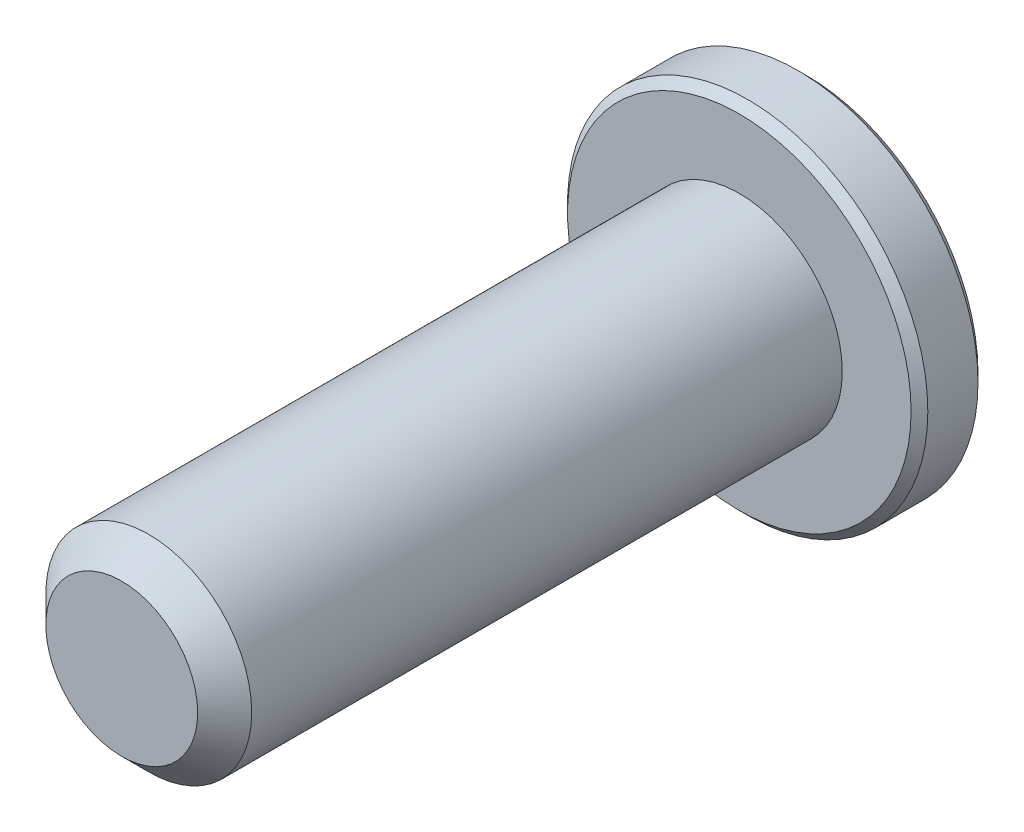
ISO-10303-21;
HEADER;
FILE_DESCRIPTION(('STEP AP214'),'2;1');
FILE_NAME('part.step','',(''),(''),'','','');
FILE_SCHEMA(('AUTOMOTIVE_DESIGN { 1 0 10303 214 1 1 1 1 }'));
ENDSEC;
DATA;
#1=APPLICATION_CONTEXT('core data for automotive mechanical design processes');
#2=APPLICATION_PROTOCOL_DEFINITION('international standard','automotive_design',2000,#1);
#3=PRODUCT_CONTEXT('',#1,'mechanical');
#4=PRODUCT('Part','Part','',(#3));
#5=PRODUCT_RELATED_PRODUCT_CATEGORY('part','',(#4));
#6=PRODUCT_DEFINITION_FORMATION('','',#4);
#7=PRODUCT_DEFINITION_CONTEXT('part definition',#1,'design');
#8=PRODUCT_DEFINITION('design','',#6,#7);
#9=PRODUCT_DEFINITION_SHAPE('','',#8);
#10=(LENGTH_UNIT() NAMED_UNIT(*) SI_UNIT(.MILLI.,.METRE.));
#11=(NAMED_UNIT(*) PLANE_ANGLE_UNIT() SI_UNIT($,.RADIAN.));
#12=(NAMED_UNIT(*) SI_UNIT($,.STERADIAN.) SOLID_ANGLE_UNIT());
#13=UNCERTAINTY_MEASURE_WITH_UNIT(LENGTH_MEASURE(1.E-05),#10,'distance_accuracy_value','');
#14=(GEOMETRIC_REPRESENTATION_CONTEXT(3) GLOBAL_UNCERTAINTY_ASSIGNED_CONTEXT((#13)) GLOBAL_UNIT_ASSIGNED_CONTEXT((#10,
#11,#12)) REPRESENTATION_CONTEXT('',''));
#15=CARTESIAN_POINT('',(0.,0.,0.));
#16=DIRECTION('',(0.,0.,1.));
#17=DIRECTION('',(1.,0.,0.));
#18=AXIS2_PLACEMENT_3D('',#15,#16,#17);
#19=CARTESIAN_POINT('',(0.,0.,-6.65));
#20=DIRECTION('',(0.,0.,1.));
#21=DIRECTION('',(1.,0.,0.));
#22=AXIS2_PLACEMENT_3D('',#19,#20,#21);
#23=PLANE('',#22);
#24=CARTESIAN_POINT('',(0.,0.,-6.65));
#25=DIRECTION('',(0.,0.,1.));
#26=DIRECTION('',(1.,0.,0.));
#27=AXIS2_PLACEMENT_3D('',#24,#25,#26);
#28=CIRCLE('',#27,3.3375);
#29=CARTESIAN_POINT('',(3.3375,0.,-6.65));
#30=VERTEX_POINT('',#29);
#31=EDGE_CURVE('E159',#30,#30,#28,.F.);
#32=ORIENTED_EDGE('',*,*,#31,.T.);
#33=EDGE_LOOP('',(#32));
#34=FACE_BOUND('',#33,.T.);
#35=CARTESIAN_POINT('',(0.,0.,-6.65));
#36=DIRECTION('',(0.,0.,1.));
#37=DIRECTION('',(1.,0.,0.));
#38=AXIS2_PLACEMENT_3D('',#35,#36,#37);
#39=CIRCLE('',#38,1.44337567297406);
#40=CARTESIAN_POINT('',(1.25,0.721687836487034,-6.65));
#41=VERTEX_POINT('',#40);
#42=CARTESIAN_POINT('',(0.,1.44337567297406,-6.65));
#43=VERTEX_POINT('',#42);
#44=EDGE_CURVE('E98',#41,#43,#39,.T.);
#45=ORIENTED_EDGE('',*,*,#44,.T.);
#46=CARTESIAN_POINT('',(0.,0.,-6.65));
#47=DIRECTION('',(0.,0.,1.));
#48=DIRECTION('',(1.,0.,0.));
#49=AXIS2_PLACEMENT_3D('',#46,#47,#48);
#50=CIRCLE('',#49,1.44337567297406);
#51=CARTESIAN_POINT('',(-1.25,0.721687836487028,-6.65));
#52=VERTEX_POINT('',#51);
#53=EDGE_CURVE('E110',#43,#52,#50,.T.);
#54=ORIENTED_EDGE('',*,*,#53,.T.);
#55=CARTESIAN_POINT('',(0.,0.,-6.65));
#56=DIRECTION('',(0.,0.,1.));
#57=DIRECTION('',(1.,0.,0.));
#58=AXIS2_PLACEMENT_3D('',#55,#56,#57);
#59=CIRCLE('',#58,1.44337567297406);
#60=CARTESIAN_POINT('',(-1.25,-0.72168783648703,-6.65));
#61=VERTEX_POINT('',#60);
#62=EDGE_CURVE('E131',#52,#61,#59,.T.);
#63=ORIENTED_EDGE('',*,*,#62,.T.);
#64=CARTESIAN_POINT('',(0.,0.,-6.65));
#65=DIRECTION('',(0.,0.,1.));
#66=DIRECTION('',(1.,0.,0.));
#67=AXIS2_PLACEMENT_3D('',#64,#65,#66);
#68=CIRCLE('',#67,1.44337567297406);
#69=CARTESIAN_POINT('',(0.,-1.44337567297406,-6.65));
#70=VERTEX_POINT('',#69);
#71=EDGE_CURVE('E416',#61,#70,#68,.T.);
#72=ORIENTED_EDGE('',*,*,#71,.T.);
#73=CARTESIAN_POINT('',(0.,0.,-6.65));
#74=DIRECTION('',(0.,0.,1.));
#75=DIRECTION('',(1.,0.,0.));
#76=AXIS2_PLACEMENT_3D('',#73,#74,#75);
#77=CIRCLE('',#76,1.44337567297406);
#78=CARTESIAN_POINT('',(1.25,-0.721687836487033,-6.65));
#79=VERTEX_POINT('',#78);
#80=EDGE_CURVE('E417',#70,#79,#77,.T.);
#81=ORIENTED_EDGE('',*,*,#80,.T.);
#82=CARTESIAN_POINT('',(0.,0.,-6.65));
#83=DIRECTION('',(0.,0.,1.));
#84=DIRECTION('',(1.,0.,0.));
#85=AXIS2_PLACEMENT_3D('',#82,#83,#84);
#86=CIRCLE('',#85,1.44337567297406);
#87=EDGE_CURVE('E113',#79,#41,#86,.T.);
#88=ORIENTED_EDGE('',*,*,#87,.T.);
#89=EDGE_LOOP('',(#45,#54,#63,#72,#81,#88));
#90=FACE_BOUND('',#89,.T.);
#91=ADVANCED_FACE('F39',(#34,#90),#23,.F.);
#92=CARTESIAN_POINT('',(1.25,0.721687836487033,-5.675));
#93=DIRECTION('',(-0.499999999999999,-0.866025403784439,0.));
#94=DIRECTION('',(0.866025403784439,-0.499999999999999,0.));
#95=AXIS2_PLACEMENT_3D('',#92,#93,#94);
#96=PLANE('',#95);
#97=DIRECTION('',(0.,0.,-1.));
#98=VECTOR('',#97,1.);
#99=CARTESIAN_POINT('',(0.,1.44337567297406,-5.675));
#100=LINE('',#99,#98);
#101=CARTESIAN_POINT('',(0.,1.44337567297406,-5.675));
#102=VERTEX_POINT('',#101);
#103=EDGE_CURVE('E127',#102,#43,#100,.T.);
#104=ORIENTED_EDGE('',*,*,#103,.T.);
#105=CARTESIAN_POINT('',(1.2502,0.721572366433196,-6.65011548390914));
#106=CARTESIAN_POINT('',(1.20722483292841,0.746384090710445,-6.6253216680551));
#107=CARTESIAN_POINT('',(1.16353099525405,0.771610739653665,-6.60198373441868));
#108=CARTESIAN_POINT('',(1.07443406915806,0.823050873919155,-6.55925200408454));
#109=CARTESIAN_POINT('',(1.02902250164293,0.849269254648334,-6.53988199236042));
#110=CARTESIAN_POINT('',(0.937452179064738,0.902137405038636,-6.50670048341348));
#111=CARTESIAN_POINT('',(0.891316759824112,0.928773701756387,-6.49280555905266));
#112=CARTESIAN_POINT('',(0.798029919592406,0.982632884076012,-6.47139728216064));
#113=CARTESIAN_POINT('',(0.750881350863619,1.00985412292348,-6.46386794156679));
#114=CARTESIAN_POINT('',(0.669626443112746,1.05676666578643,-6.45707449805071));
#115=CARTESIAN_POINT('',(0.635625123372058,1.07639733689152,-6.45606855910435));
#116=CARTESIAN_POINT('',(0.567682235567521,1.11562418145499,-6.45776141491132));
#117=CARTESIAN_POINT('',(0.533740682344341,1.1352203463451,-6.46046102721554));
#118=CARTESIAN_POINT('',(0.4661851435425,1.1742235548576,-6.46940893031638));
#119=CARTESIAN_POINT('',(0.432571492713224,1.19363040521232,-6.47566052589971));
#120=CARTESIAN_POINT('',(0.365905361782186,1.23212011385119,-6.49137568141391));
#121=CARTESIAN_POINT('',(0.332853128969704,1.2512028293628,-6.50084062008746));
#122=CARTESIAN_POINT('',(0.248200308399735,1.30007715810653,-6.52893139068759));
#123=CARTESIAN_POINT('',(0.197133507570361,1.32956058931202,-6.5496701574522));
#124=CARTESIAN_POINT('',(0.0969991458867448,1.38737318998519,-6.59638713467148));
#125=CARTESIAN_POINT('',(0.0479256884217303,1.41570576386268,-6.62234829594677));
#126=CARTESIAN_POINT('',(-0.000199999999999984,1.4434911430279,-6.65011548390914));
#127=B_SPLINE_CURVE_WITH_KNOTS('',3,(#105,#106,#107,#108,#109,#110,#111,#112,#113,#114,#115,
#116,#117,#118,#119,#120,#121,#122,#123,#124,#125,#126),.UNSPECIFIED.,.F.,.F.,(4,2,2,2,2,2,2,2,
2,2,4),(0.,0.166533409618303,0.33403760728976,0.498880396489696,0.663307919240271,
0.780963963458823,0.898645970148449,1.01643764860773,1.13427993171549,1.3214865203214,
1.50809158792573),.UNSPECIFIED.);
#128=EDGE_CURVE('E95',#41,#43,#127,.T.);
#129=ORIENTED_EDGE('',*,*,#128,.F.);
#130=DIRECTION('',(0.,0.,-1.));
#131=VECTOR('',#130,1.);
#132=CARTESIAN_POINT('',(1.25,0.721687836487033,-5.675));
#133=LINE('',#132,#131);
#134=CARTESIAN_POINT('',(1.25,0.721687836487033,-5.675));
#135=VERTEX_POINT('',#134);
#136=EDGE_CURVE('E394',#135,#41,#133,.T.);
#137=ORIENTED_EDGE('',*,*,#136,.F.);
#138=DIRECTION('',(-0.866025403784439,0.499999999999999,0.));
#139=VECTOR('',#138,1.);
#140=CARTESIAN_POINT('',(1.25,0.721687836487033,-5.675));
#141=LINE('',#140,#139);
#142=EDGE_CURVE('E122',#135,#102,#141,.T.);
#143=ORIENTED_EDGE('',*,*,#142,.T.);
#144=EDGE_LOOP('',(#104,#129,#137,#143));
#145=FACE_BOUND('',#144,.T.);
#146=ADVANCED_FACE('F134',(#145),#96,.T.);
#147=CARTESIAN_POINT('',(1.25,-0.721687836487029,-5.675));
#148=DIRECTION('',(-1.,0.,0.));
#149=DIRECTION('',(0.,-1.,0.));
#150=AXIS2_PLACEMENT_3D('',#147,#148,#149);
#151=PLANE('',#150);
#152=ORIENTED_EDGE('',*,*,#136,.T.);
#153=CARTESIAN_POINT('',(1.25,-1.38992943348888,-7.07595678276481));
#154=CARTESIAN_POINT('',(1.25,-1.35585360144598,-7.05062384590546));
#155=CARTESIAN_POINT('',(1.25,-1.32158265708561,-7.0255540386235));
#156=CARTESIAN_POINT('',(1.25,-1.25257320054391,-6.97604777210552));
#157=CARTESIAN_POINT('',(1.25,-1.21783456799034,-6.95161148084676));
#158=CARTESIAN_POINT('',(1.25,-1.11229379200971,-6.87906617261387));
#159=CARTESIAN_POINT('',(1.25,-1.04068485708168,-6.83211103925946));
#160=CARTESIAN_POINT('',(1.25,-0.890834011639571,-6.74037081666435));
#161=CARTESIAN_POINT('',(1.25,-0.812441254075324,-6.69582917123014));
#162=CARTESIAN_POINT('',(1.25,-0.651805951733885,-6.61466295887272));
#163=CARTESIAN_POINT('',(1.25,-0.56957751460335,-6.57801179406796));
#164=CARTESIAN_POINT('',(1.25,-0.445666902783946,-6.53318878472561));
#165=CARTESIAN_POINT('',(1.25,-0.405715906756982,-6.52024564314349));
#166=CARTESIAN_POINT('',(1.25,-0.324892689132276,-6.4975737854096));
#167=CARTESIAN_POINT('',(1.25,-0.284020400151317,-6.48784530519787));
#168=CARTESIAN_POINT('',(1.25,-0.202258662465061,-6.47225763981377));
#169=CARTESIAN_POINT('',(1.25,-0.161381483064384,-6.46633507343161));
#170=CARTESIAN_POINT('',(1.25,-0.0792441307238302,-6.45846702132594));
#171=CARTESIAN_POINT('',(1.25,-0.0379840154943749,-6.45652094579608));
#172=CARTESIAN_POINT('',(1.25,0.043234160036465,-6.45673289649202));
#173=CARTESIAN_POINT('',(1.25,0.0831926097530767,-6.45876454904398));
#174=CARTESIAN_POINT('',(1.25,0.16274644611995,-6.46655218105582));
#175=CARTESIAN_POINT('',(1.25,0.202341758544679,-6.47230890544306));
#176=CARTESIAN_POINT('',(1.25,0.28154631912982,-6.48733861417404));
#177=CARTESIAN_POINT('',(1.25,0.321144394728611,-6.49666962749469));
#178=CARTESIAN_POINT('',(1.25,0.399480919290786,-6.51836703523828));
#179=CARTESIAN_POINT('',(1.25,0.438219456017128,-6.53073311819671));
#180=CARTESIAN_POINT('',(1.25,0.562551887219005,-6.57501108328111));
#181=CARTESIAN_POINT('',(1.25,0.646311872820087,-6.61206181080176));
#182=CARTESIAN_POINT('',(1.25,0.809873231963305,-6.69436414583907));
#183=CARTESIAN_POINT('',(1.25,0.88965874213862,-6.73964571023902));
#184=CARTESIAN_POINT('',(1.25,1.04210036236046,-6.83298293010409));
#185=CARTESIAN_POINT('',(1.25,1.11491334005909,-6.88078550196313));
#186=CARTESIAN_POINT('',(1.25,1.22219009712169,-6.95464867004972));
#187=CARTESIAN_POINT('',(1.25,1.25748474843868,-6.97952350030935));
#188=CARTESIAN_POINT('',(1.25,1.32759376690005,-7.02992188471591));
#189=CARTESIAN_POINT('',(1.25,1.36240826213734,-7.05544526047357));
#190=CARTESIAN_POINT('',(1.25,1.3970231565127,-7.08123727369858));
#191=B_SPLINE_CURVE_WITH_KNOTS('',3,(#153,#154,#155,#156,#157,#158,#159,#160,#161,#162,#163,
#164,#165,#166,#167,#168,#169,#170,#171,#172,#173,#174,#175,#176,#177,#178,#179,#180,#181,#182,
#183,#184,#185,#186,#187,#188,#189,#190),.UNSPECIFIED.,.F.,.F.,(4,2,2,2,2,2,2,2,2,2,2,2,2,2,2,2,
2,2,4),(0.,0.127379033817002,0.254791503830238,0.51156114040546,0.781814668857771,
1.05114242314894,1.17702064742503,1.30290810848098,1.42664072359053,1.55035498493451,
1.67020252454504,1.7900740382739,1.91198034452075,2.03387414574236,2.30782771694623,
2.58279909340041,2.84397769429347,2.97351138093345,3.10300981562539),.UNSPECIFIED.);
#192=EDGE_CURVE('E103',#79,#41,#191,.T.);
#193=ORIENTED_EDGE('',*,*,#192,.F.);
#194=DIRECTION('',(0.,0.,-1.));
#195=VECTOR('',#194,1.);
#196=CARTESIAN_POINT('',(1.25,-0.721687836487029,-5.675));
#197=LINE('',#196,#195);
#198=CARTESIAN_POINT('',(1.25,-0.721687836487029,-5.675));
#199=VERTEX_POINT('',#198);
#200=EDGE_CURVE('E397',#199,#79,#197,.T.);
#201=ORIENTED_EDGE('',*,*,#200,.F.);
#202=DIRECTION('',(0.,1.,0.));
#203=VECTOR('',#202,1.);
#204=CARTESIAN_POINT('',(1.25,-0.721687836487029,-5.675));
#205=LINE('',#204,#203);
#206=EDGE_CURVE('E55',#199,#135,#205,.T.);
#207=ORIENTED_EDGE('',*,*,#206,.T.);
#208=EDGE_LOOP('',(#152,#193,#201,#207));
#209=FACE_BOUND('',#208,.T.);
#210=ADVANCED_FACE('F183',(#209),#151,.T.);
#211=CARTESIAN_POINT('',(0.,-1.44337567297406,-5.675));
#212=DIRECTION('',(-0.5,0.866025403784438,0.));
#213=DIRECTION('',(-0.866025403784439,-0.5,0.));
#214=AXIS2_PLACEMENT_3D('',#211,#212,#213);
#215=PLANE('',#214);
#216=ORIENTED_EDGE('',*,*,#200,.T.);
#217=CARTESIAN_POINT('',(-0.000199999999999349,-1.4434911430279,-6.65011548390913));
#218=CARTESIAN_POINT('',(0.0427751670715871,-1.41867941875065,-6.6253216680551));
#219=CARTESIAN_POINT('',(0.0864690047459484,-1.39345276980743,-6.60198373441868));
#220=CARTESIAN_POINT('',(0.175565930841942,-1.34201263554194,-6.55925200408454));
#221=CARTESIAN_POINT('',(0.220977498357064,-1.31579425481276,-6.53988199236041));
#222=CARTESIAN_POINT('',(0.31254782093526,-1.26292610442246,-6.50670048341348));
#223=CARTESIAN_POINT('',(0.358683240175886,-1.23628980770471,-6.49280555905265));
#224=CARTESIAN_POINT('',(0.451970080407592,-1.18243062538508,-6.47139728216064));
#225=CARTESIAN_POINT('',(0.499118649136379,-1.15520938653761,-6.46386794156679));
#226=CARTESIAN_POINT('',(0.580373556887252,-1.10829684367466,-6.4570744980507));
#227=CARTESIAN_POINT('',(0.61437487662794,-1.08866617256958,-6.45606855910435));
#228=CARTESIAN_POINT('',(0.682317764432477,-1.04943932800611,-6.45776141491132));
#229=CARTESIAN_POINT('',(0.716259317655656,-1.02984316311599,-6.46046102721554));
#230=CARTESIAN_POINT('',(0.783814856457498,-0.990839954603495,-6.46940893031638));
#231=CARTESIAN_POINT('',(0.817428507286774,-0.971433104248767,-6.47566052589971));
#232=CARTESIAN_POINT('',(0.884094638217812,-0.932943395609902,-6.4913756814139));
#233=CARTESIAN_POINT('',(0.917146871030294,-0.913860680098297,-6.50084062008746));
#234=CARTESIAN_POINT('',(1.00179969160026,-0.864986351354565,-6.52893139068759));
#235=CARTESIAN_POINT('',(1.05286649242964,-0.835502920149073,-6.5496701574522));
#236=CARTESIAN_POINT('',(1.15300085411325,-0.777690319475906,-6.59638713467148));
#237=CARTESIAN_POINT('',(1.20207431157827,-0.749357745598414,-6.62234829594677));
#238=CARTESIAN_POINT('',(1.2502,-0.721572366433192,-6.65011548390913));
#239=B_SPLINE_CURVE_WITH_KNOTS('',3,(#217,#218,#219,#220,#221,#222,#223,#224,#225,#226,#227,
#228,#229,#230,#231,#232,#233,#234,#235,#236,#237,#238),.UNSPECIFIED.,.F.,.F.,(4,2,2,2,2,2,2,2,
2,2,4),(0.,0.166533409618303,0.334037607289761,0.498880396489697,0.663307919240273,
0.780963963458825,0.898645970148451,1.01643764860773,1.13427993171549,1.3214865203214,
1.50809158792573),.UNSPECIFIED.);
#240=EDGE_CURVE('E425',#70,#79,#239,.T.);
#241=ORIENTED_EDGE('',*,*,#240,.F.);
#242=DIRECTION('',(0.,0.,-1.));
#243=VECTOR('',#242,1.);
#244=CARTESIAN_POINT('',(0.,-1.44337567297406,-5.675));
#245=LINE('',#244,#243);
#246=CARTESIAN_POINT('',(0.,-1.44337567297406,-5.675));
#247=VERTEX_POINT('',#246);
#248=EDGE_CURVE('E400',#247,#70,#245,.T.);
#249=ORIENTED_EDGE('',*,*,#248,.F.);
#250=DIRECTION('',(0.866025403784438,0.5,0.));
#251=VECTOR('',#250,1.);
#252=CARTESIAN_POINT('',(0.,-1.44337567297406,-5.675));
#253=LINE('',#252,#251);
#254=EDGE_CURVE('E63',#247,#199,#253,.T.);
#255=ORIENTED_EDGE('',*,*,#254,.T.);
#256=EDGE_LOOP('',(#216,#241,#249,#255));
#257=FACE_BOUND('',#256,.T.);
#258=ADVANCED_FACE('F301',(#257),#215,.T.);
#259=CARTESIAN_POINT('',(-1.25,-0.721687836487029,-5.675));
#260=DIRECTION('',(0.499999999999999,0.866025403784439,0.));
#261=DIRECTION('',(-0.866025403784439,0.499999999999999,0.));
#262=AXIS2_PLACEMENT_3D('',#259,#260,#261);
#263=PLANE('',#262);
#264=ORIENTED_EDGE('',*,*,#248,.T.);
#265=CARTESIAN_POINT('',(-1.2502,-0.721572366433191,-6.65011548390914));
#266=CARTESIAN_POINT('',(-1.20722483292841,-0.746384090710441,-6.62532166805511));
#267=CARTESIAN_POINT('',(-1.16353099525405,-0.771610739653661,-6.60198373441869));
#268=CARTESIAN_POINT('',(-1.07443406915806,-0.823050873919151,-6.55925200408454));
#269=CARTESIAN_POINT('',(-1.02902250164294,-0.84926925464833,-6.53988199236042));
#270=CARTESIAN_POINT('',(-0.93745217906474,-0.902137405038632,-6.50670048341348));
#271=CARTESIAN_POINT('',(-0.891316759824114,-0.928773701756384,-6.49280555905266));
#272=CARTESIAN_POINT('',(-0.798029919592407,-0.982632884076009,-6.47139728216064));
#273=CARTESIAN_POINT('',(-0.75088135086362,-1.00985412292348,-6.46386794156679));
#274=CARTESIAN_POINT('',(-0.669626443112747,-1.05676666578642,-6.4570744980507));
#275=CARTESIAN_POINT('',(-0.635625123372059,-1.07639733689151,-6.45606855910435));
#276=CARTESIAN_POINT('',(-0.567682235567523,-1.11562418145498,-6.45776141491132));
#277=CARTESIAN_POINT('',(-0.533740682344343,-1.1352203463451,-6.46046102721554));
#278=CARTESIAN_POINT('',(-0.466185143542501,-1.17422355485759,-6.46940893031638));
#279=CARTESIAN_POINT('',(-0.432571492713225,-1.19363040521232,-6.47566052589971));
#280=CARTESIAN_POINT('',(-0.365905361782187,-1.23212011385119,-6.4913756814139));
#281=CARTESIAN_POINT('',(-0.332853128969705,-1.25120282936279,-6.50084062008746));
#282=CARTESIAN_POINT('',(-0.248200308399736,-1.30007715810652,-6.52893139068759));
#283=CARTESIAN_POINT('',(-0.197133507570362,-1.32956058931202,-6.5496701574522));
#284=CARTESIAN_POINT('',(-0.0969991458867451,-1.38737318998518,-6.59638713467148));
#285=CARTESIAN_POINT('',(-0.0479256884217303,-1.41570576386268,-6.62234829594677));
#286=CARTESIAN_POINT('',(0.000200000000000548,-1.4434911430279,-6.65011548390913));
#287=B_SPLINE_CURVE_WITH_KNOTS('',3,(#265,#266,#267,#268,#269,#270,#271,#272,#273,#274,#275,
#276,#277,#278,#279,#280,#281,#282,#283,#284,#285,#286),.UNSPECIFIED.,.F.,.F.,(4,2,2,2,2,2,2,2,
2,2,4),(0.,0.166533409618304,0.334037607289762,0.498880396489699,0.663307919240275,
0.780963963458827,0.898645970148453,1.01643764860773,1.13427993171549,1.32148652032141,
1.50809158792574),.UNSPECIFIED.);
#288=EDGE_CURVE('E413',#61,#70,#287,.T.);
#289=ORIENTED_EDGE('',*,*,#288,.F.);
#290=DIRECTION('',(0.,0.,-1.));
#291=VECTOR('',#290,1.);
#292=CARTESIAN_POINT('',(-1.25,-0.721687836487029,-5.675));
#293=LINE('',#292,#291);
#294=CARTESIAN_POINT('',(-1.25,-0.721687836487029,-5.675));
#295=VERTEX_POINT('',#294);
#296=EDGE_CURVE('E144',#295,#61,#293,.T.);
#297=ORIENTED_EDGE('',*,*,#296,.F.);
#298=DIRECTION('',(0.866025403784439,-0.499999999999999,0.));
#299=VECTOR('',#298,1.);
#300=CARTESIAN_POINT('',(-1.25,-0.721687836487029,-5.675));
#301=LINE('',#300,#299);
#302=EDGE_CURVE('E387',#295,#247,#301,.T.);
#303=ORIENTED_EDGE('',*,*,#302,.T.);
#304=EDGE_LOOP('',(#264,#289,#297,#303));
#305=FACE_BOUND('',#304,.T.);
#306=ADVANCED_FACE('F309',(#305),#263,.T.);
#307=CARTESIAN_POINT('',(-1.25,0.721687836487031,-5.675));
#308=DIRECTION('',(1.,0.,0.));
#309=DIRECTION('',(0.,0.,-1.));
#310=AXIS2_PLACEMENT_3D('',#307,#308,#309);
#311=PLANE('',#310);
#312=ORIENTED_EDGE('',*,*,#296,.T.);
#313=CARTESIAN_POINT('',(-1.25,-1.38992943348888,-7.07595678276481));
#314=CARTESIAN_POINT('',(-1.25,-1.35585360144598,-7.05062384590546));
#315=CARTESIAN_POINT('',(-1.25,-1.32158265708561,-7.0255540386235));
#316=CARTESIAN_POINT('',(-1.25,-1.25257320054391,-6.97604777210552));
#317=CARTESIAN_POINT('',(-1.25,-1.21783456799034,-6.95161148084676));
#318=CARTESIAN_POINT('',(-1.25,-1.11229379200971,-6.87906617261387));
#319=CARTESIAN_POINT('',(-1.25,-1.04068485708168,-6.83211103925947));
#320=CARTESIAN_POINT('',(-1.25,-0.890834011639572,-6.74037081666435));
#321=CARTESIAN_POINT('',(-1.25,-0.812441254075324,-6.69582917123015));
#322=CARTESIAN_POINT('',(-1.25,-0.651805951733885,-6.61466295887273));
#323=CARTESIAN_POINT('',(-1.25,-0.569577514603349,-6.57801179406797));
#324=CARTESIAN_POINT('',(-1.25,-0.445666902783945,-6.53318878472562));
#325=CARTESIAN_POINT('',(-1.25,-0.405715906756981,-6.5202456431435));
#326=CARTESIAN_POINT('',(-1.25,-0.324892689132275,-6.49757378540961));
#327=CARTESIAN_POINT('',(-1.25,-0.284020400151316,-6.48784530519787));
#328=CARTESIAN_POINT('',(-1.25,-0.202258662465059,-6.47225763981378));
#329=CARTESIAN_POINT('',(-1.25,-0.161381483064382,-6.46633507343162));
#330=CARTESIAN_POINT('',(-1.25,-0.0792441307238288,-6.45846702132595));
#331=CARTESIAN_POINT('',(-1.25,-0.0379840154943736,-6.45652094579608));
#332=CARTESIAN_POINT('',(-1.25,0.0432341600364662,-6.45673289649202));
#333=CARTESIAN_POINT('',(-1.25,0.0831926097530779,-6.45876454904398));
#334=CARTESIAN_POINT('',(-1.25,0.162746446119951,-6.46655218105583));
#335=CARTESIAN_POINT('',(-1.25,0.20234175854468,-6.47230890544306));
#336=CARTESIAN_POINT('',(-1.25,0.281546319129821,-6.48733861417404));
#337=CARTESIAN_POINT('',(-1.25,0.321144394728613,-6.4966696274947));
#338=CARTESIAN_POINT('',(-1.25,0.399480919290787,-6.51836703523828));
#339=CARTESIAN_POINT('',(-1.25,0.438219456017129,-6.53073311819672));
#340=CARTESIAN_POINT('',(-1.25,0.562551887219007,-6.57501108328111));
#341=CARTESIAN_POINT('',(-1.25,0.64631187282009,-6.61206181080177));
#342=CARTESIAN_POINT('',(-1.25,0.80987323196331,-6.69436414583907));
#343=CARTESIAN_POINT('',(-1.25,0.889658742138625,-6.73964571023903));
#344=CARTESIAN_POINT('',(-1.25,1.04210036236047,-6.83298293010409));
#345=CARTESIAN_POINT('',(-1.25,1.11491334005909,-6.88078550196313));
#346=CARTESIAN_POINT('',(-1.25,1.2221900971217,-6.95464867004973));
#347=CARTESIAN_POINT('',(-1.25,1.25748474843869,-6.97952350030935));
#348=CARTESIAN_POINT('',(-1.25,1.32759376690005,-7.02992188471592));
#349=CARTESIAN_POINT('',(-1.25,1.36240826213735,-7.05544526047358));
#350=CARTESIAN_POINT('',(-1.25,1.39702315651271,-7.08123727369859));
#351=B_SPLINE_CURVE_WITH_KNOTS('',3,(#313,#314,#315,#316,#317,#318,#319,#320,#321,#322,#323,
#324,#325,#326,#327,#328,#329,#330,#331,#332,#333,#334,#335,#336,#337,#338,#339,#340,#341,#342,
#343,#344,#345,#346,#347,#348,#349,#350),.UNSPECIFIED.,.F.,.F.,(4,2,2,2,2,2,2,2,2,2,2,2,2,2,2,2,
2,2,4),(0.,0.127379033817002,0.254791503830238,0.51156114040546,0.781814668857772,
1.05114242314894,1.17702064742504,1.30290810848098,1.42664072359054,1.55035498493452,
1.67020252454504,1.7900740382739,1.91198034452075,2.03387414574236,2.30782771694623,
2.58279909340042,2.84397769429347,2.97351138093346,3.10300981562539),.UNSPECIFIED.);
#352=EDGE_CURVE('E408',#52,#61,#351,.F.);
#353=ORIENTED_EDGE('',*,*,#352,.F.);
#354=DIRECTION('',(0.,0.,-1.));
#355=VECTOR('',#354,1.);
#356=CARTESIAN_POINT('',(-1.25,0.721687836487031,-5.675));
#357=LINE('',#356,#355);
#358=CARTESIAN_POINT('',(-1.25,0.721687836487031,-5.675));
#359=VERTEX_POINT('',#358);
#360=EDGE_CURVE('E129',#359,#52,#357,.T.);
#361=ORIENTED_EDGE('',*,*,#360,.F.);
#362=DIRECTION('',(0.,-1.,0.));
#363=VECTOR('',#362,1.);
#364=CARTESIAN_POINT('',(-1.25,0.721687836487031,-5.675));
#365=LINE('',#364,#363);
#366=EDGE_CURVE('E384',#359,#295,#365,.T.);
#367=ORIENTED_EDGE('',*,*,#366,.T.);
#368=EDGE_LOOP('',(#312,#353,#361,#367));
#369=FACE_BOUND('',#368,.T.);
#370=ADVANCED_FACE('F317',(#369),#311,.T.);
#371=CARTESIAN_POINT('',(0.,1.44337567297406,-5.675));
#372=DIRECTION('',(0.5,-0.866025403784439,0.));
#373=DIRECTION('',(0.866025403784439,0.5,0.));
#374=AXIS2_PLACEMENT_3D('',#371,#372,#373);
#375=PLANE('',#374);
#376=ORIENTED_EDGE('',*,*,#360,.T.);
#377=CARTESIAN_POINT('',(0.000200000000000002,1.4434911430279,-6.65011548390914));
#378=CARTESIAN_POINT('',(-0.0427751670715865,1.41867941875065,-6.62532166805511));
#379=CARTESIAN_POINT('',(-0.0864690047459477,1.39345276980743,-6.60198373441868));
#380=CARTESIAN_POINT('',(-0.175565930841941,1.34201263554194,-6.55925200408454));
#381=CARTESIAN_POINT('',(-0.220977498357063,1.31579425481276,-6.53988199236042));
#382=CARTESIAN_POINT('',(-0.312547820935259,1.26292610442246,-6.50670048341348));
#383=CARTESIAN_POINT('',(-0.358683240175885,1.23628980770471,-6.49280555905266));
#384=CARTESIAN_POINT('',(-0.451970080407591,1.18243062538508,-6.47139728216064));
#385=CARTESIAN_POINT('',(-0.499118649136378,1.15520938653761,-6.46386794156679));
#386=CARTESIAN_POINT('',(-0.58037355688725,1.10829684367467,-6.45707449805071));
#387=CARTESIAN_POINT('',(-0.614374876627939,1.08866617256958,-6.45606855910435));
#388=CARTESIAN_POINT('',(-0.682317764432475,1.04943932800611,-6.45776141491132));
#389=CARTESIAN_POINT('',(-0.716259317655655,1.02984316311599,-6.46046102721554));
#390=CARTESIAN_POINT('',(-0.783814856457497,0.990839954603499,-6.46940893031638));
#391=CARTESIAN_POINT('',(-0.817428507286772,0.971433104248771,-6.47566052589971));
#392=CARTESIAN_POINT('',(-0.884094638217811,0.932943395609905,-6.49137568141391));
#393=CARTESIAN_POINT('',(-0.917146871030293,0.9138606800983,-6.50084062008746));
#394=CARTESIAN_POINT('',(-1.00179969160026,0.864986351354567,-6.52893139068759));
#395=CARTESIAN_POINT('',(-1.05286649242964,0.835502920149075,-6.5496701574522));
#396=CARTESIAN_POINT('',(-1.15300085411325,0.777690319475907,-6.59638713467148));
#397=CARTESIAN_POINT('',(-1.20207431157827,0.749357745598415,-6.62234829594677));
#398=CARTESIAN_POINT('',(-1.2502,0.721572366433193,-6.65011548390914));
#399=B_SPLINE_CURVE_WITH_KNOTS('',3,(#377,#378,#379,#380,#381,#382,#383,#384,#385,#386,#387,
#388,#389,#390,#391,#392,#393,#394,#395,#396,#397,#398),.UNSPECIFIED.,.F.,.F.,(4,2,2,2,2,2,2,2,
2,2,4),(0.,0.166533409618303,0.33403760728976,0.498880396489697,0.663307919240272,
0.780963963458824,0.89864597014845,1.01643764860773,1.13427993171549,1.32148652032141,
1.50809158792574),.UNSPECIFIED.);
#400=EDGE_CURVE('E120',#43,#52,#399,.T.);
#401=ORIENTED_EDGE('',*,*,#400,.F.);
#402=ORIENTED_EDGE('',*,*,#103,.F.);
#403=DIRECTION('',(-0.866025403784439,-0.5,0.));
#404=VECTOR('',#403,1.);
#405=CARTESIAN_POINT('',(0.,1.44337567297406,-5.675));
#406=LINE('',#405,#404);
#407=EDGE_CURVE('E381',#102,#359,#406,.T.);
#408=ORIENTED_EDGE('',*,*,#407,.T.);
#409=EDGE_LOOP('',(#376,#401,#402,#408));
#410=FACE_BOUND('',#409,.T.);
#411=ADVANCED_FACE('F126',(#410),#375,.T.);
#412=CARTESIAN_POINT('',(0.,0.,6.65));
#413=DIRECTION('',(0.,0.,-1.));
#414=DIRECTION('',(-1.,0.,0.));
#415=AXIS2_PLACEMENT_3D('',#412,#413,#414);
#416=CYLINDRICAL_SURFACE('',#415,2.);
#417=CARTESIAN_POINT('',(0.,0.,6.12499999999999));
#418=DIRECTION('',(0.,0.,1.));
#419=DIRECTION('',(1.,0.,0.));
#420=AXIS2_PLACEMENT_3D('',#417,#418,#419);
#421=CIRCLE('',#420,2.);
#422=CARTESIAN_POINT('',(2.,0.,6.12499999999999));
#423=VERTEX_POINT('',#422);
#424=EDGE_CURVE('E11',#423,#423,#421,.F.);
#425=ORIENTED_EDGE('',*,*,#424,.T.);
#426=EDGE_LOOP('',(#425));
#427=FACE_BOUND('',#426,.T.);
#428=CARTESIAN_POINT('',(0.,0.,-5.35));
#429=DIRECTION('',(0.,0.,1.));
#430=DIRECTION('',(1.,0.,0.));
#431=AXIS2_PLACEMENT_3D('',#428,#429,#430);
#432=CIRCLE('',#431,2.);
#433=CARTESIAN_POINT('',(2.,0.,-5.35));
#434=VERTEX_POINT('',#433);
#435=EDGE_CURVE('E137',#434,#434,#432,.T.);
#436=ORIENTED_EDGE('',*,*,#435,.T.);
#437=EDGE_LOOP('',(#436));
#438=FACE_BOUND('',#437,.T.);
#439=ADVANCED_FACE('F195',(#427,#438),#416,.T.);
#440=CARTESIAN_POINT('',(0.,0.,6.65));
#441=DIRECTION('',(0.,0.,1.));
#442=DIRECTION('',(1.,0.,0.));
#443=AXIS2_PLACEMENT_3D('',#440,#441,#442);
#444=PLANE('',#443);
#445=CARTESIAN_POINT('',(0.,0.,6.65));
#446=DIRECTION('',(0.,0.,1.));
#447=DIRECTION('',(1.,0.,0.));
#448=AXIS2_PLACEMENT_3D('',#445,#446,#447);
#449=CIRCLE('',#448,1.47499999999999);
#450=CARTESIAN_POINT('',(1.47499999999999,0.,6.65));
#451=VERTEX_POINT('',#450);
#452=EDGE_CURVE('E48',#451,#451,#449,.T.);
#453=ORIENTED_EDGE('',*,*,#452,.T.);
#454=EDGE_LOOP('',(#453));
#455=FACE_BOUND('',#454,.T.);
#456=ADVANCED_FACE('F166',(#455),#444,.T.);
#457=CARTESIAN_POINT('',(0.,0.,-5.35));
#458=DIRECTION('',(0.,0.,1.));
#459=DIRECTION('',(1.,0.,0.));
#460=AXIS2_PLACEMENT_3D('',#457,#458,#459);
#461=PLANE('',#460);
#462=CARTESIAN_POINT('',(0.,0.,-5.35));
#463=DIRECTION('',(0.,0.,1.));
#464=DIRECTION('',(1.,0.,0.));
#465=AXIS2_PLACEMENT_3D('',#462,#463,#464);
#466=CIRCLE('',#465,3.3375);
#467=CARTESIAN_POINT('',(3.3375,0.,-5.35));
#468=VERTEX_POINT('',#467);
#469=EDGE_CURVE('E142',#468,#468,#466,.T.);
#470=ORIENTED_EDGE('',*,*,#469,.T.);
#471=EDGE_LOOP('',(#470));
#472=FACE_BOUND('',#471,.T.);
#473=ORIENTED_EDGE('',*,*,#435,.F.);
#474=EDGE_LOOP('',(#473));
#475=FACE_BOUND('',#474,.T.);
#476=ADVANCED_FACE('F187',(#472,#475),#461,.T.);
#477=CARTESIAN_POINT('',(0.,0.,-5.35));
#478=DIRECTION('',(0.,0.,-1.));
#479=DIRECTION('',(-1.,0.,0.));
#480=AXIS2_PLACEMENT_3D('',#477,#478,#479);
#481=CYLINDRICAL_SURFACE('',#480,3.5);
#482=CARTESIAN_POINT('',(0.,0.,-5.5125));
#483=DIRECTION('',(0.,0.,1.));
#484=DIRECTION('',(1.,0.,0.));
#485=AXIS2_PLACEMENT_3D('',#482,#483,#484);
#486=CIRCLE('',#485,3.5);
#487=CARTESIAN_POINT('',(3.5,0.,-5.5125));
#488=VERTEX_POINT('',#487);
#489=EDGE_CURVE('E155',#488,#488,#486,.F.);
#490=ORIENTED_EDGE('',*,*,#489,.T.);
#491=EDGE_LOOP('',(#490));
#492=FACE_BOUND('',#491,.T.);
#493=CARTESIAN_POINT('',(0.,0.,-6.48750000000001));
#494=DIRECTION('',(0.,0.,1.));
#495=DIRECTION('',(1.,0.,0.));
#496=AXIS2_PLACEMENT_3D('',#493,#494,#495);
#497=CIRCLE('',#496,3.5);
#498=CARTESIAN_POINT('',(3.5,0.,-6.48750000000001));
#499=VERTEX_POINT('',#498);
#500=EDGE_CURVE('E151',#499,#499,#497,.T.);
#501=ORIENTED_EDGE('',*,*,#500,.T.);
#502=EDGE_LOOP('',(#501));
#503=FACE_BOUND('',#502,.T.);
#504=ADVANCED_FACE('F188',(#492,#503),#481,.T.);
#505=CARTESIAN_POINT('',(-1.25,2.16506350946109,-5.675));
#506=DIRECTION('',(0.,0.,1.));
#507=DIRECTION('',(1.,0.,0.));
#508=AXIS2_PLACEMENT_3D('',#505,#506,#507);
#509=PLANE('',#508);
#510=ORIENTED_EDGE('',*,*,#142,.F.);
#511=ORIENTED_EDGE('',*,*,#206,.F.);
#512=ORIENTED_EDGE('',*,*,#254,.F.);
#513=ORIENTED_EDGE('',*,*,#302,.F.);
#514=ORIENTED_EDGE('',*,*,#366,.F.);
#515=ORIENTED_EDGE('',*,*,#407,.F.);
#516=EDGE_LOOP('',(#510,#511,#512,#513,#514,#515));
#517=FACE_BOUND('',#516,.T.);
#518=ADVANCED_FACE('F191',(#517),#509,.F.);
#519=CARTESIAN_POINT('',(0.,0.,-6.65));
#520=DIRECTION('',(0.,0.,-1.));
#521=DIRECTION('',(1.,0.,0.));
#522=AXIS2_PLACEMENT_3D('',#519,#520,#521);
#523=CONICAL_SURFACE('',#522,1.44337567297406,0.78539816339745);
#524=ORIENTED_EDGE('',*,*,#400,.T.);
#525=ORIENTED_EDGE('',*,*,#53,.F.);
#526=EDGE_LOOP('',(#524,#525));
#527=FACE_BOUND('',#526,.T.);
#528=ADVANCED_FACE('F119',(#527),#523,.F.);
#529=CARTESIAN_POINT('',(0.,0.,-6.65));
#530=DIRECTION('',(0.,0.,-1.));
#531=DIRECTION('',(1.,0.,0.));
#532=AXIS2_PLACEMENT_3D('',#529,#530,#531);
#533=CONICAL_SURFACE('',#532,1.44337567297406,0.78539816339745);
#534=ORIENTED_EDGE('',*,*,#352,.T.);
#535=ORIENTED_EDGE('',*,*,#62,.F.);
#536=EDGE_LOOP('',(#534,#535));
#537=FACE_BOUND('',#536,.T.);
#538=ADVANCED_FACE('F236',(#537),#533,.F.);
#539=CARTESIAN_POINT('',(0.,0.,-6.65));
#540=DIRECTION('',(0.,0.,-1.));
#541=DIRECTION('',(1.,0.,0.));
#542=AXIS2_PLACEMENT_3D('',#539,#540,#541);
#543=CONICAL_SURFACE('',#542,1.44337567297406,0.78539816339745);
#544=ORIENTED_EDGE('',*,*,#288,.T.);
#545=ORIENTED_EDGE('',*,*,#71,.F.);
#546=EDGE_LOOP('',(#544,#545));
#547=FACE_BOUND('',#546,.T.);
#548=ADVANCED_FACE('F244',(#547),#543,.F.);
#549=CARTESIAN_POINT('',(0.,0.,-6.65));
#550=DIRECTION('',(0.,0.,-1.));
#551=DIRECTION('',(1.,0.,0.));
#552=AXIS2_PLACEMENT_3D('',#549,#550,#551);
#553=CONICAL_SURFACE('',#552,1.44337567297406,0.78539816339745);
#554=ORIENTED_EDGE('',*,*,#240,.T.);
#555=ORIENTED_EDGE('',*,*,#80,.F.);
#556=EDGE_LOOP('',(#554,#555));
#557=FACE_BOUND('',#556,.T.);
#558=ADVANCED_FACE('F252',(#557),#553,.F.);
#559=CARTESIAN_POINT('',(0.,0.,-6.65));
#560=DIRECTION('',(0.,0.,-1.));
#561=DIRECTION('',(1.,0.,0.));
#562=AXIS2_PLACEMENT_3D('',#559,#560,#561);
#563=CONICAL_SURFACE('',#562,1.44337567297406,0.78539816339745);
#564=ORIENTED_EDGE('',*,*,#192,.T.);
#565=ORIENTED_EDGE('',*,*,#87,.F.);
#566=EDGE_LOOP('',(#564,#565));
#567=FACE_BOUND('',#566,.T.);
#568=ADVANCED_FACE('F204',(#567),#563,.F.);
#569=CARTESIAN_POINT('',(0.,0.,-6.65));
#570=DIRECTION('',(0.,0.,-1.));
#571=DIRECTION('',(1.,0.,0.));
#572=AXIS2_PLACEMENT_3D('',#569,#570,#571);
#573=CONICAL_SURFACE('',#572,1.44337567297406,0.78539816339745);
#574=ORIENTED_EDGE('',*,*,#128,.T.);
#575=ORIENTED_EDGE('',*,*,#44,.F.);
#576=EDGE_LOOP('',(#574,#575));
#577=FACE_BOUND('',#576,.T.);
#578=ADVANCED_FACE('F97',(#577),#573,.F.);
#579=CARTESIAN_POINT('',(0.,0.,-5.35));
#580=DIRECTION('',(0.,0.,-1.));
#581=DIRECTION('',(-1.,0.,0.));
#582=AXIS2_PLACEMENT_3D('',#579,#580,#581);
#583=CONICAL_SURFACE('',#582,3.3375,0.785398163397447);
#584=ORIENTED_EDGE('',*,*,#489,.F.);
#585=EDGE_LOOP('',(#584));
#586=FACE_BOUND('',#585,.T.);
#587=ORIENTED_EDGE('',*,*,#469,.F.);
#588=EDGE_LOOP('',(#587));
#589=FACE_BOUND('',#588,.T.);
#590=ADVANCED_FACE('F174',(#586,#589),#583,.T.);
#591=CARTESIAN_POINT('',(0.,0.,-6.48750000000001));
#592=DIRECTION('',(0.,0.,1.));
#593=DIRECTION('',(1.,0.,0.));
#594=AXIS2_PLACEMENT_3D('',#591,#592,#593);
#595=CONICAL_SURFACE('',#594,3.5,0.785398163397458);
#596=ORIENTED_EDGE('',*,*,#31,.F.);
#597=EDGE_LOOP('',(#596));
#598=FACE_BOUND('',#597,.T.);
#599=ORIENTED_EDGE('',*,*,#500,.F.);
#600=EDGE_LOOP('',(#599));
#601=FACE_BOUND('',#600,.T.);
#602=ADVANCED_FACE('F169',(#598,#601),#595,.T.);
#603=CARTESIAN_POINT('',(0.,0.,6.65));
#604=DIRECTION('',(0.,0.,-1.));
#605=DIRECTION('',(-1.,0.,0.));
#606=AXIS2_PLACEMENT_3D('',#603,#604,#605);
#607=CONICAL_SURFACE('',#606,1.47499999999999,0.785398163397447);
#608=ORIENTED_EDGE('',*,*,#424,.F.);
#609=EDGE_LOOP('',(#608));
#610=FACE_BOUND('',#609,.T.);
#611=ORIENTED_EDGE('',*,*,#452,.F.);
#612=EDGE_LOOP('',(#611));
#613=FACE_BOUND('',#612,.T.);
#614=ADVANCED_FACE('F41',(#610,#613),#607,.T.);
#615=CLOSED_SHELL('',(#91,#146,#210,#258,#306,#370,#411,#439,#456,#476,#504,#518,#528,#538,#548,
#558,#568,#578,#590,#602,#614));
#616=MANIFOLD_SOLID_BREP('B2',#615);
#617=ADVANCED_BREP_SHAPE_REPRESENTATION('',(#18,#616),#14);
#618=SHAPE_DEFINITION_REPRESENTATION(#9,#617);
ENDSEC;
END-ISO-10303-21;
